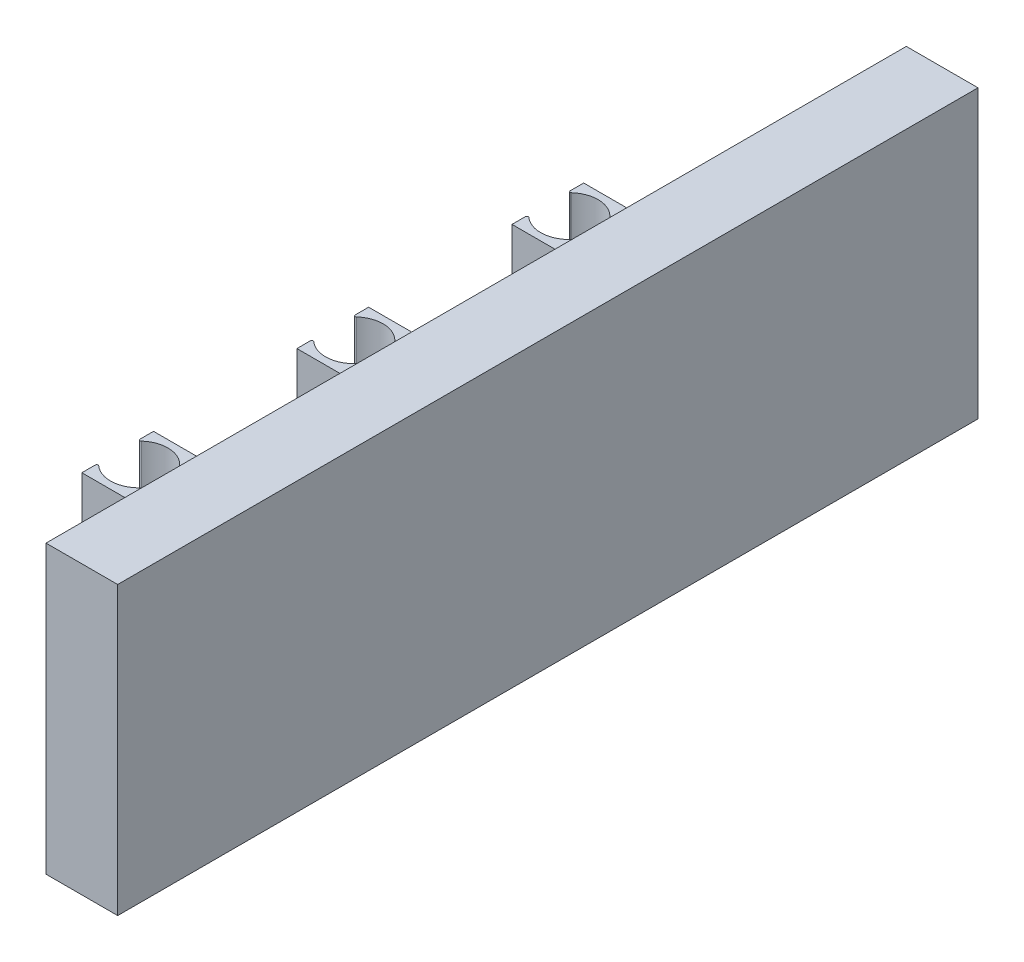
ISO-10303-21;
HEADER;
FILE_DESCRIPTION(('STEP AP214'),'2;1');
FILE_NAME('part.step','',(''),(''),'','','');
FILE_SCHEMA(('AUTOMOTIVE_DESIGN { 1 0 10303 214 1 1 1 1 }'));
ENDSEC;
DATA;
#1=APPLICATION_CONTEXT('core data for automotive mechanical design processes');
#2=APPLICATION_PROTOCOL_DEFINITION('international standard','automotive_design',2000,#1);
#3=PRODUCT_CONTEXT('',#1,'mechanical');
#4=PRODUCT('Part','Part','',(#3));
#5=PRODUCT_RELATED_PRODUCT_CATEGORY('part','',(#4));
#6=PRODUCT_DEFINITION_FORMATION('','',#4);
#7=PRODUCT_DEFINITION_CONTEXT('part definition',#1,'design');
#8=PRODUCT_DEFINITION('design','',#6,#7);
#9=PRODUCT_DEFINITION_SHAPE('','',#8);
#10=(LENGTH_UNIT() NAMED_UNIT(*) SI_UNIT(.MILLI.,.METRE.));
#11=(NAMED_UNIT(*) PLANE_ANGLE_UNIT() SI_UNIT($,.RADIAN.));
#12=(NAMED_UNIT(*) SI_UNIT($,.STERADIAN.) SOLID_ANGLE_UNIT());
#13=UNCERTAINTY_MEASURE_WITH_UNIT(LENGTH_MEASURE(1.E-05),#10,'distance_accuracy_value','');
#14=(GEOMETRIC_REPRESENTATION_CONTEXT(3) GLOBAL_UNCERTAINTY_ASSIGNED_CONTEXT((#13)) GLOBAL_UNIT_ASSIGNED_CONTEXT((#10,
#11,#12)) REPRESENTATION_CONTEXT('',''));
#15=CARTESIAN_POINT('',(0.,0.,0.));
#16=DIRECTION('',(0.,0.,1.));
#17=DIRECTION('',(1.,0.,0.));
#18=AXIS2_PLACEMENT_3D('',#15,#16,#17);
#19=CARTESIAN_POINT('',(-15.,0.,0.));
#20=DIRECTION('',(1.,0.,0.));
#21=DIRECTION('',(0.,0.,-1.));
#22=AXIS2_PLACEMENT_3D('',#19,#20,#21);
#23=PLANE('',#22);
#24=DIRECTION('',(0.,0.,1.));
#25=VECTOR('',#24,1.);
#26=CARTESIAN_POINT('',(-15.,-3.,12.5));
#27=LINE('',#26,#25);
#28=CARTESIAN_POINT('',(-15.,-3.,12.5));
#29=VERTEX_POINT('',#28);
#30=CARTESIAN_POINT('',(-15.,-3.,13.4347524157502));
#31=VERTEX_POINT('',#30);
#32=EDGE_CURVE('E406',#29,#31,#27,.T.);
#33=ORIENTED_EDGE('',*,*,#32,.T.);
#34=DIRECTION('',(0.,1.,0.));
#35=VECTOR('',#34,1.);
#36=CARTESIAN_POINT('',(-15.,0.,13.4347524157502));
#37=LINE('',#36,#35);
#38=CARTESIAN_POINT('',(-15.,3.,13.4347524157502));
#39=VERTEX_POINT('',#38);
#40=EDGE_CURVE('E390',#31,#39,#37,.T.);
#41=ORIENTED_EDGE('',*,*,#40,.T.);
#42=DIRECTION('',(0.,0.,-1.));
#43=VECTOR('',#42,1.);
#44=CARTESIAN_POINT('',(-15.,3.,12.5));
#45=LINE('',#44,#43);
#46=CARTESIAN_POINT('',(-15.,3.,12.5));
#47=VERTEX_POINT('',#46);
#48=EDGE_CURVE('E228',#39,#47,#45,.T.);
#49=ORIENTED_EDGE('',*,*,#48,.T.);
#50=DIRECTION('',(0.,-1.,0.));
#51=VECTOR('',#50,1.);
#52=CARTESIAN_POINT('',(-15.,-3.,12.5));
#53=LINE('',#52,#51);
#54=EDGE_CURVE('E227',#47,#29,#53,.T.);
#55=ORIENTED_EDGE('',*,*,#54,.T.);
#56=EDGE_LOOP('',(#33,#41,#49,#55));
#57=FACE_BOUND('',#56,.T.);
#58=ADVANCED_FACE('F33',(#57),#23,.F.);
#59=CARTESIAN_POINT('',(-15.,0.,0.));
#60=DIRECTION('',(1.,0.,0.));
#61=DIRECTION('',(0.,0.,-1.));
#62=AXIS2_PLACEMENT_3D('',#59,#60,#61);
#63=PLANE('',#62);
#64=DIRECTION('',(0.,0.,-1.));
#65=VECTOR('',#64,1.);
#66=CARTESIAN_POINT('',(-15.,3.,-2.5));
#67=LINE('',#66,#65);
#68=CARTESIAN_POINT('',(-15.,3.,2.5));
#69=VERTEX_POINT('',#68);
#70=CARTESIAN_POINT('',(-15.,3.,1.56524758424985));
#71=VERTEX_POINT('',#70);
#72=EDGE_CURVE('E257',#69,#71,#67,.T.);
#73=ORIENTED_EDGE('',*,*,#72,.T.);
#74=DIRECTION('',(0.,-1.,0.));
#75=VECTOR('',#74,1.);
#76=CARTESIAN_POINT('',(-15.,0.,1.56524758424985));
#77=LINE('',#76,#75);
#78=CARTESIAN_POINT('',(-15.,-3.,1.56524758424985));
#79=VERTEX_POINT('',#78);
#80=EDGE_CURVE('E387',#71,#79,#77,.T.);
#81=ORIENTED_EDGE('',*,*,#80,.T.);
#82=DIRECTION('',(0.,0.,1.));
#83=VECTOR('',#82,1.);
#84=CARTESIAN_POINT('',(-15.,-3.,-2.5));
#85=LINE('',#84,#83);
#86=CARTESIAN_POINT('',(-15.,-3.,2.5));
#87=VERTEX_POINT('',#86);
#88=EDGE_CURVE('E262',#79,#87,#85,.T.);
#89=ORIENTED_EDGE('',*,*,#88,.T.);
#90=DIRECTION('',(0.,1.,0.));
#91=VECTOR('',#90,1.);
#92=CARTESIAN_POINT('',(-15.,-3.,2.5));
#93=LINE('',#92,#91);
#94=EDGE_CURVE('E252',#87,#69,#93,.T.);
#95=ORIENTED_EDGE('',*,*,#94,.T.);
#96=EDGE_LOOP('',(#73,#81,#89,#95));
#97=FACE_BOUND('',#96,.T.);
#98=ADVANCED_FACE('F463',(#97),#63,.F.);
#99=CARTESIAN_POINT('',(-15.,0.,0.));
#100=DIRECTION('',(1.,0.,0.));
#101=DIRECTION('',(0.,0.,-1.));
#102=AXIS2_PLACEMENT_3D('',#99,#100,#101);
#103=PLANE('',#102);
#104=DIRECTION('',(0.,0.,1.));
#105=VECTOR('',#104,1.);
#106=CARTESIAN_POINT('',(-15.,-3.00000000000001,-17.5));
#107=LINE('',#106,#105);
#108=CARTESIAN_POINT('',(-15.,-3.00000000000001,-17.5));
#109=VERTEX_POINT('',#108);
#110=CARTESIAN_POINT('',(-15.,-3.00000000000001,-16.5652475842499));
#111=VERTEX_POINT('',#110);
#112=EDGE_CURVE('E297',#109,#111,#107,.T.);
#113=ORIENTED_EDGE('',*,*,#112,.T.);
#114=DIRECTION('',(0.,1.,0.));
#115=VECTOR('',#114,1.);
#116=CARTESIAN_POINT('',(-15.,0.,-16.5652475842499));
#117=LINE('',#116,#115);
#118=CARTESIAN_POINT('',(-15.,2.99999999999999,-16.5652475842499));
#119=VERTEX_POINT('',#118);
#120=EDGE_CURVE('E349',#111,#119,#117,.T.);
#121=ORIENTED_EDGE('',*,*,#120,.T.);
#122=DIRECTION('',(0.,0.,-1.));
#123=VECTOR('',#122,1.);
#124=CARTESIAN_POINT('',(-15.,2.99999999999999,-17.5));
#125=LINE('',#124,#123);
#126=CARTESIAN_POINT('',(-15.,2.99999999999999,-17.5));
#127=VERTEX_POINT('',#126);
#128=EDGE_CURVE('E289',#119,#127,#125,.T.);
#129=ORIENTED_EDGE('',*,*,#128,.T.);
#130=DIRECTION('',(0.,-1.,0.));
#131=VECTOR('',#130,1.);
#132=CARTESIAN_POINT('',(-15.,-3.00000000000001,-17.5));
#133=LINE('',#132,#131);
#134=EDGE_CURVE('E294',#127,#109,#133,.T.);
#135=ORIENTED_EDGE('',*,*,#134,.T.);
#136=EDGE_LOOP('',(#113,#121,#129,#135));
#137=FACE_BOUND('',#136,.T.);
#138=ADVANCED_FACE('F453',(#137),#103,.F.);
#139=CARTESIAN_POINT('',(-5.,0.,0.));
#140=DIRECTION('',(1.,0.,0.));
#141=DIRECTION('',(0.,0.,-1.));
#142=AXIS2_PLACEMENT_3D('',#139,#140,#141);
#143=PLANE('',#142);
#144=DIRECTION('',(0.,1.,0.));
#145=VECTOR('',#144,1.);
#146=CARTESIAN_POINT('',(-5.,-3.,2.5));
#147=LINE('',#146,#145);
#148=CARTESIAN_POINT('',(-5.,-3.,2.5));
#149=VERTEX_POINT('',#148);
#150=CARTESIAN_POINT('',(-5.,3.,2.5));
#151=VERTEX_POINT('',#150);
#152=EDGE_CURVE('E241',#149,#151,#147,.T.);
#153=ORIENTED_EDGE('',*,*,#152,.F.);
#154=DIRECTION('',(0.,0.,1.));
#155=VECTOR('',#154,1.);
#156=CARTESIAN_POINT('',(-5.,-3.,-2.5));
#157=LINE('',#156,#155);
#158=CARTESIAN_POINT('',(-5.,-3.,-2.5));
#159=VERTEX_POINT('',#158);
#160=EDGE_CURVE('E256',#159,#149,#157,.T.);
#161=ORIENTED_EDGE('',*,*,#160,.F.);
#162=DIRECTION('',(0.,-1.,0.));
#163=VECTOR('',#162,1.);
#164=CARTESIAN_POINT('',(-5.,-3.,-2.5));
#165=LINE('',#164,#163);
#166=CARTESIAN_POINT('',(-5.,3.,-2.5));
#167=VERTEX_POINT('',#166);
#168=EDGE_CURVE('E269',#167,#159,#165,.T.);
#169=ORIENTED_EDGE('',*,*,#168,.F.);
#170=DIRECTION('',(0.,0.,-1.));
#171=VECTOR('',#170,1.);
#172=CARTESIAN_POINT('',(-5.,3.,-2.5));
#173=LINE('',#172,#171);
#174=EDGE_CURVE('E245',#151,#167,#173,.T.);
#175=ORIENTED_EDGE('',*,*,#174,.F.);
#176=EDGE_LOOP('',(#153,#161,#169,#175));
#177=FACE_BOUND('',#176,.T.);
#178=DIRECTION('',(0.,1.,0.));
#179=VECTOR('',#178,1.);
#180=CARTESIAN_POINT('',(-5.,10.,-30.));
#181=LINE('',#180,#179);
#182=CARTESIAN_POINT('',(-5.,-10.,-30.));
#183=VERTEX_POINT('',#182);
#184=CARTESIAN_POINT('',(-5.,10.,-30.));
#185=VERTEX_POINT('',#184);
#186=EDGE_CURVE('E323',#183,#185,#181,.T.);
#187=ORIENTED_EDGE('',*,*,#186,.F.);
#188=DIRECTION('',(0.,0.,-1.));
#189=VECTOR('',#188,1.);
#190=CARTESIAN_POINT('',(-5.,-10.,30.));
#191=LINE('',#190,#189);
#192=CARTESIAN_POINT('',(-5.,-10.,30.));
#193=VERTEX_POINT('',#192);
#194=EDGE_CURVE('E333',#193,#183,#191,.T.);
#195=ORIENTED_EDGE('',*,*,#194,.F.);
#196=DIRECTION('',(0.,-1.,0.));
#197=VECTOR('',#196,1.);
#198=CARTESIAN_POINT('',(-5.,10.,30.));
#199=LINE('',#198,#197);
#200=CARTESIAN_POINT('',(-5.,10.,30.));
#201=VERTEX_POINT('',#200);
#202=EDGE_CURVE('E330',#201,#193,#199,.T.);
#203=ORIENTED_EDGE('',*,*,#202,.F.);
#204=DIRECTION('',(0.,0.,1.));
#205=VECTOR('',#204,1.);
#206=CARTESIAN_POINT('',(-5.,10.,30.));
#207=LINE('',#206,#205);
#208=EDGE_CURVE('E326',#185,#201,#207,.T.);
#209=ORIENTED_EDGE('',*,*,#208,.F.);
#210=EDGE_LOOP('',(#187,#195,#203,#209));
#211=FACE_BOUND('',#210,.T.);
#212=DIRECTION('',(0.,1.,0.));
#213=VECTOR('',#212,1.);
#214=CARTESIAN_POINT('',(-5.,-3.00000000000001,-12.5));
#215=LINE('',#214,#213);
#216=CARTESIAN_POINT('',(-5.,-3.00000000000001,-12.5));
#217=VERTEX_POINT('',#216);
#218=CARTESIAN_POINT('',(-5.,2.99999999999999,-12.5));
#219=VERTEX_POINT('',#218);
#220=EDGE_CURVE('E285',#217,#219,#215,.T.);
#221=ORIENTED_EDGE('',*,*,#220,.F.);
#222=DIRECTION('',(0.,0.,1.));
#223=VECTOR('',#222,1.);
#224=CARTESIAN_POINT('',(-5.,-3.00000000000001,-17.5));
#225=LINE('',#224,#223);
#226=CARTESIAN_POINT('',(-5.,-3.00000000000001,-17.5));
#227=VERTEX_POINT('',#226);
#228=EDGE_CURVE('E290',#227,#217,#225,.T.);
#229=ORIENTED_EDGE('',*,*,#228,.F.);
#230=DIRECTION('',(0.,-1.,0.));
#231=VECTOR('',#230,1.);
#232=CARTESIAN_POINT('',(-5.,-3.00000000000001,-17.5));
#233=LINE('',#232,#231);
#234=CARTESIAN_POINT('',(-5.,2.99999999999999,-17.5));
#235=VERTEX_POINT('',#234);
#236=EDGE_CURVE('E306',#235,#227,#233,.T.);
#237=ORIENTED_EDGE('',*,*,#236,.F.);
#238=DIRECTION('',(0.,0.,-1.));
#239=VECTOR('',#238,1.);
#240=CARTESIAN_POINT('',(-5.,2.99999999999999,-17.5));
#241=LINE('',#240,#239);
#242=EDGE_CURVE('E303',#219,#235,#241,.T.);
#243=ORIENTED_EDGE('',*,*,#242,.F.);
#244=EDGE_LOOP('',(#221,#229,#237,#243));
#245=FACE_BOUND('',#244,.T.);
#246=DIRECTION('',(0.,1.,0.));
#247=VECTOR('',#246,1.);
#248=CARTESIAN_POINT('',(-5.,-3.,17.5));
#249=LINE('',#248,#247);
#250=CARTESIAN_POINT('',(-5.,-3.,17.5));
#251=VERTEX_POINT('',#250);
#252=CARTESIAN_POINT('',(-5.,3.,17.5));
#253=VERTEX_POINT('',#252);
#254=EDGE_CURVE('E240',#251,#253,#249,.T.);
#255=ORIENTED_EDGE('',*,*,#254,.F.);
#256=DIRECTION('',(0.,0.,1.));
#257=VECTOR('',#256,1.);
#258=CARTESIAN_POINT('',(-5.,-3.,12.5));
#259=LINE('',#258,#257);
#260=CARTESIAN_POINT('',(-5.,-3.,12.5));
#261=VERTEX_POINT('',#260);
#262=EDGE_CURVE('E237',#261,#251,#259,.T.);
#263=ORIENTED_EDGE('',*,*,#262,.F.);
#264=DIRECTION('',(0.,-1.,0.));
#265=VECTOR('',#264,1.);
#266=CARTESIAN_POINT('',(-5.,-3.,12.5));
#267=LINE('',#266,#265);
#268=CARTESIAN_POINT('',(-5.,3.,12.5));
#269=VERTEX_POINT('',#268);
#270=EDGE_CURVE('E442',#269,#261,#267,.T.);
#271=ORIENTED_EDGE('',*,*,#270,.F.);
#272=DIRECTION('',(0.,0.,-1.));
#273=VECTOR('',#272,1.);
#274=CARTESIAN_POINT('',(-5.,3.,12.5));
#275=LINE('',#274,#273);
#276=EDGE_CURVE('E440',#253,#269,#275,.T.);
#277=ORIENTED_EDGE('',*,*,#276,.F.);
#278=EDGE_LOOP('',(#255,#263,#271,#277));
#279=FACE_BOUND('',#278,.T.);
#280=ADVANCED_FACE('F450',(#177,#211,#245,#279),#143,.F.);
#281=CARTESIAN_POINT('',(-5.,10.,-30.));
#282=DIRECTION('',(0.,0.,-1.));
#283=DIRECTION('',(-1.,0.,0.));
#284=AXIS2_PLACEMENT_3D('',#281,#282,#283);
#285=PLANE('',#284);
#286=DIRECTION('',(0.,1.,0.));
#287=VECTOR('',#286,1.);
#288=CARTESIAN_POINT('',(0.,10.,-30.));
#289=LINE('',#288,#287);
#290=CARTESIAN_POINT('',(0.,-10.,-30.));
#291=VERTEX_POINT('',#290);
#292=CARTESIAN_POINT('',(0.,10.,-30.));
#293=VERTEX_POINT('',#292);
#294=EDGE_CURVE('E322',#291,#293,#289,.T.);
#295=ORIENTED_EDGE('',*,*,#294,.F.);
#296=DIRECTION('',(1.,0.,0.));
#297=VECTOR('',#296,1.);
#298=CARTESIAN_POINT('',(-5.,-10.,-30.));
#299=LINE('',#298,#297);
#300=EDGE_CURVE('E347',#183,#291,#299,.T.);
#301=ORIENTED_EDGE('',*,*,#300,.F.);
#302=ORIENTED_EDGE('',*,*,#186,.T.);
#303=DIRECTION('',(1.,0.,0.));
#304=VECTOR('',#303,1.);
#305=CARTESIAN_POINT('',(-5.,10.,-30.));
#306=LINE('',#305,#304);
#307=EDGE_CURVE('E336',#185,#293,#306,.T.);
#308=ORIENTED_EDGE('',*,*,#307,.T.);
#309=EDGE_LOOP('',(#295,#301,#302,#308));
#310=FACE_BOUND('',#309,.T.);
#311=ADVANCED_FACE('F452',(#310),#285,.T.);
#312=CARTESIAN_POINT('',(-5.,-10.,30.));
#313=DIRECTION('',(0.,-1.,0.));
#314=DIRECTION('',(0.,0.,-1.));
#315=AXIS2_PLACEMENT_3D('',#312,#313,#314);
#316=PLANE('',#315);
#317=DIRECTION('',(0.,0.,-1.));
#318=VECTOR('',#317,1.);
#319=CARTESIAN_POINT('',(0.,-10.,30.));
#320=LINE('',#319,#318);
#321=CARTESIAN_POINT('',(0.,-10.,30.));
#322=VERTEX_POINT('',#321);
#323=EDGE_CURVE('E327',#322,#291,#320,.T.);
#324=ORIENTED_EDGE('',*,*,#323,.F.);
#325=DIRECTION('',(1.,0.,0.));
#326=VECTOR('',#325,1.);
#327=CARTESIAN_POINT('',(-5.,-10.,30.));
#328=LINE('',#327,#326);
#329=EDGE_CURVE('E350',#193,#322,#328,.T.);
#330=ORIENTED_EDGE('',*,*,#329,.F.);
#331=ORIENTED_EDGE('',*,*,#194,.T.);
#332=ORIENTED_EDGE('',*,*,#300,.T.);
#333=EDGE_LOOP('',(#324,#330,#331,#332));
#334=FACE_BOUND('',#333,.T.);
#335=ADVANCED_FACE('F460',(#334),#316,.T.);
#336=CARTESIAN_POINT('',(-5.,10.,30.));
#337=DIRECTION('',(0.,0.,1.));
#338=DIRECTION('',(0.,-1.,0.));
#339=AXIS2_PLACEMENT_3D('',#336,#337,#338);
#340=PLANE('',#339);
#341=DIRECTION('',(0.,-1.,0.));
#342=VECTOR('',#341,1.);
#343=CARTESIAN_POINT('',(0.,10.,30.));
#344=LINE('',#343,#342);
#345=CARTESIAN_POINT('',(0.,10.,30.));
#346=VERTEX_POINT('',#345);
#347=EDGE_CURVE('E342',#346,#322,#344,.T.);
#348=ORIENTED_EDGE('',*,*,#347,.F.);
#349=DIRECTION('',(1.,0.,0.));
#350=VECTOR('',#349,1.);
#351=CARTESIAN_POINT('',(-5.,10.,30.));
#352=LINE('',#351,#350);
#353=EDGE_CURVE('E352',#201,#346,#352,.T.);
#354=ORIENTED_EDGE('',*,*,#353,.F.);
#355=ORIENTED_EDGE('',*,*,#202,.T.);
#356=ORIENTED_EDGE('',*,*,#329,.T.);
#357=EDGE_LOOP('',(#348,#354,#355,#356));
#358=FACE_BOUND('',#357,.T.);
#359=ADVANCED_FACE('F749',(#358),#340,.T.);
#360=CARTESIAN_POINT('',(-5.,10.,30.));
#361=DIRECTION('',(0.,1.,0.));
#362=DIRECTION('',(0.,0.,1.));
#363=AXIS2_PLACEMENT_3D('',#360,#361,#362);
#364=PLANE('',#363);
#365=DIRECTION('',(0.,0.,1.));
#366=VECTOR('',#365,1.);
#367=CARTESIAN_POINT('',(0.,10.,30.));
#368=LINE('',#367,#366);
#369=EDGE_CURVE('E339',#293,#346,#368,.T.);
#370=ORIENTED_EDGE('',*,*,#369,.F.);
#371=ORIENTED_EDGE('',*,*,#307,.F.);
#372=ORIENTED_EDGE('',*,*,#208,.T.);
#373=ORIENTED_EDGE('',*,*,#353,.T.);
#374=EDGE_LOOP('',(#370,#371,#372,#373));
#375=FACE_BOUND('',#374,.T.);
#376=ADVANCED_FACE('F535',(#375),#364,.T.);
#377=CARTESIAN_POINT('',(0.,0.,0.));
#378=DIRECTION('',(1.,0.,0.));
#379=DIRECTION('',(0.,0.,-1.));
#380=AXIS2_PLACEMENT_3D('',#377,#378,#379);
#381=PLANE('',#380);
#382=ORIENTED_EDGE('',*,*,#294,.T.);
#383=ORIENTED_EDGE('',*,*,#369,.T.);
#384=ORIENTED_EDGE('',*,*,#347,.T.);
#385=ORIENTED_EDGE('',*,*,#323,.T.);
#386=EDGE_LOOP('',(#382,#383,#384,#385));
#387=FACE_BOUND('',#386,.T.);
#388=ADVANCED_FACE('F530',(#387),#381,.T.);
#389=CARTESIAN_POINT('',(-15.,-3.00000000000001,-12.5));
#390=DIRECTION('',(0.,0.,-1.));
#391=DIRECTION('',(-1.,0.,0.));
#392=AXIS2_PLACEMENT_3D('',#389,#390,#391);
#393=PLANE('',#392);
#394=ORIENTED_EDGE('',*,*,#220,.T.);
#395=DIRECTION('',(1.,0.,0.));
#396=VECTOR('',#395,1.);
#397=CARTESIAN_POINT('',(-15.,2.99999999999999,-12.5));
#398=LINE('',#397,#396);
#399=CARTESIAN_POINT('',(-15.,2.99999999999999,-12.5));
#400=VERTEX_POINT('',#399);
#401=EDGE_CURVE('E319',#400,#219,#398,.T.);
#402=ORIENTED_EDGE('',*,*,#401,.F.);
#403=DIRECTION('',(0.,1.,0.));
#404=VECTOR('',#403,1.);
#405=CARTESIAN_POINT('',(-15.,-3.00000000000001,-12.5));
#406=LINE('',#405,#404);
#407=CARTESIAN_POINT('',(-15.,-3.00000000000001,-12.5));
#408=VERTEX_POINT('',#407);
#409=EDGE_CURVE('E286',#408,#400,#406,.T.);
#410=ORIENTED_EDGE('',*,*,#409,.F.);
#411=DIRECTION('',(1.,0.,0.));
#412=VECTOR('',#411,1.);
#413=CARTESIAN_POINT('',(-15.,-3.00000000000001,-12.5));
#414=LINE('',#413,#412);
#415=EDGE_CURVE('E300',#408,#217,#414,.T.);
#416=ORIENTED_EDGE('',*,*,#415,.T.);
#417=EDGE_LOOP('',(#394,#402,#410,#416));
#418=FACE_BOUND('',#417,.T.);
#419=ADVANCED_FACE('F527',(#418),#393,.F.);
#420=CARTESIAN_POINT('',(-15.,2.99999999999999,-17.5));
#421=DIRECTION('',(0.,-1.,0.));
#422=DIRECTION('',(0.,0.,-1.));
#423=AXIS2_PLACEMENT_3D('',#420,#421,#422);
#424=PLANE('',#423);
#425=ORIENTED_EDGE('',*,*,#128,.F.);
#426=CARTESIAN_POINT('',(-14.9,2.99999999999999,-16.5652475842499));
#427=DIRECTION('',(0.,-1.,0.));
#428=DIRECTION('',(0.,0.,-1.));
#429=AXIS2_PLACEMENT_3D('',#426,#427,#428);
#430=CIRCLE('',#429,0.1);
#431=CARTESIAN_POINT('',(-14.8333333333333,2.99999999999999,-16.4907119849999));
#432=VERTEX_POINT('',#431);
#433=EDGE_CURVE('E359',#119,#432,#430,.F.);
#434=ORIENTED_EDGE('',*,*,#433,.T.);
#435=CARTESIAN_POINT('',(-13.5,2.99999999999999,-15.));
#436=DIRECTION('',(0.,-1.,0.));
#437=DIRECTION('',(0.,0.,-1.));
#438=AXIS2_PLACEMENT_3D('',#435,#436,#437);
#439=CIRCLE('',#438,2.);
#440=CARTESIAN_POINT('',(-14.8333333333333,2.99999999999999,-13.5092880150001));
#441=VERTEX_POINT('',#440);
#442=EDGE_CURVE('E435',#432,#441,#439,.T.);
#443=ORIENTED_EDGE('',*,*,#442,.T.);
#444=CARTESIAN_POINT('',(-14.9,2.99999999999999,-13.4347524157501));
#445=DIRECTION('',(0.,-1.,0.));
#446=DIRECTION('',(0.,0.,-1.));
#447=AXIS2_PLACEMENT_3D('',#444,#445,#446);
#448=CIRCLE('',#447,0.1);
#449=CARTESIAN_POINT('',(-15.,2.99999999999999,-13.4347524157501));
#450=VERTEX_POINT('',#449);
#451=EDGE_CURVE('E357',#441,#450,#448,.F.);
#452=ORIENTED_EDGE('',*,*,#451,.T.);
#453=EDGE_CURVE('E291',#400,#450,#125,.T.);
#454=ORIENTED_EDGE('',*,*,#453,.F.);
#455=ORIENTED_EDGE('',*,*,#401,.T.);
#456=ORIENTED_EDGE('',*,*,#242,.T.);
#457=DIRECTION('',(1.,0.,0.));
#458=VECTOR('',#457,1.);
#459=CARTESIAN_POINT('',(-15.,2.99999999999999,-17.5));
#460=LINE('',#459,#458);
#461=EDGE_CURVE('E316',#127,#235,#460,.T.);
#462=ORIENTED_EDGE('',*,*,#461,.F.);
#463=EDGE_LOOP('',(#425,#434,#443,#452,#454,#455,#456,#462));
#464=FACE_BOUND('',#463,.T.);
#465=ADVANCED_FACE('F524',(#464),#424,.F.);
#466=CARTESIAN_POINT('',(-15.,-3.00000000000001,-17.5));
#467=DIRECTION('',(0.,0.,1.));
#468=DIRECTION('',(0.,-1.,0.));
#469=AXIS2_PLACEMENT_3D('',#466,#467,#468);
#470=PLANE('',#469);
#471=ORIENTED_EDGE('',*,*,#236,.T.);
#472=DIRECTION('',(1.,0.,0.));
#473=VECTOR('',#472,1.);
#474=CARTESIAN_POINT('',(-15.,-3.00000000000001,-17.5));
#475=LINE('',#474,#473);
#476=EDGE_CURVE('E313',#109,#227,#475,.T.);
#477=ORIENTED_EDGE('',*,*,#476,.F.);
#478=ORIENTED_EDGE('',*,*,#134,.F.);
#479=ORIENTED_EDGE('',*,*,#461,.T.);
#480=EDGE_LOOP('',(#471,#477,#478,#479));
#481=FACE_BOUND('',#480,.T.);
#482=ADVANCED_FACE('F520',(#481),#470,.F.);
#483=CARTESIAN_POINT('',(-15.,-3.00000000000001,-17.5));
#484=DIRECTION('',(0.,1.,0.));
#485=DIRECTION('',(0.,0.,1.));
#486=AXIS2_PLACEMENT_3D('',#483,#484,#485);
#487=PLANE('',#486);
#488=CARTESIAN_POINT('',(-13.5,-3.,-15.));
#489=DIRECTION('',(0.,1.,0.));
#490=DIRECTION('',(0.,0.,1.));
#491=AXIS2_PLACEMENT_3D('',#488,#489,#490);
#492=CIRCLE('',#491,2.);
#493=CARTESIAN_POINT('',(-14.8333333333333,-3.,-16.4907119849999));
#494=VERTEX_POINT('',#493);
#495=CARTESIAN_POINT('',(-14.8333333333333,-3.,-13.5092880150001));
#496=VERTEX_POINT('',#495);
#497=EDGE_CURVE('E432',#494,#496,#492,.F.);
#498=ORIENTED_EDGE('',*,*,#497,.F.);
#499=CARTESIAN_POINT('',(-14.9,-3.,-16.5652475842499));
#500=DIRECTION('',(0.,1.,0.));
#501=DIRECTION('',(0.,0.,1.));
#502=AXIS2_PLACEMENT_3D('',#499,#500,#501);
#503=CIRCLE('',#502,0.1);
#504=EDGE_CURVE('E368',#494,#111,#503,.F.);
#505=ORIENTED_EDGE('',*,*,#504,.T.);
#506=ORIENTED_EDGE('',*,*,#112,.F.);
#507=ORIENTED_EDGE('',*,*,#476,.T.);
#508=ORIENTED_EDGE('',*,*,#228,.T.);
#509=ORIENTED_EDGE('',*,*,#415,.F.);
#510=CARTESIAN_POINT('',(-15.,-3.00000000000001,-13.4347524157501));
#511=VERTEX_POINT('',#510);
#512=EDGE_CURVE('E296',#511,#408,#107,.T.);
#513=ORIENTED_EDGE('',*,*,#512,.F.);
#514=CARTESIAN_POINT('',(-14.9,-3.,-13.4347524157501));
#515=DIRECTION('',(0.,1.,0.));
#516=DIRECTION('',(0.,0.,1.));
#517=AXIS2_PLACEMENT_3D('',#514,#515,#516);
#518=CIRCLE('',#517,0.1);
#519=EDGE_CURVE('E366',#511,#496,#518,.F.);
#520=ORIENTED_EDGE('',*,*,#519,.T.);
#521=EDGE_LOOP('',(#498,#505,#506,#507,#508,#509,#513,#520));
#522=FACE_BOUND('',#521,.T.);
#523=ADVANCED_FACE('F516',(#522),#487,.F.);
#524=ORIENTED_EDGE('',*,*,#453,.T.);
#525=DIRECTION('',(0.,1.,0.));
#526=VECTOR('',#525,1.);
#527=CARTESIAN_POINT('',(-15.,0.,-13.4347524157501));
#528=LINE('',#527,#526);
#529=EDGE_CURVE('E370',#450,#511,#528,.F.);
#530=ORIENTED_EDGE('',*,*,#529,.T.);
#531=ORIENTED_EDGE('',*,*,#512,.T.);
#532=ORIENTED_EDGE('',*,*,#409,.T.);
#533=EDGE_LOOP('',(#524,#530,#531,#532));
#534=FACE_BOUND('',#533,.T.);
#535=ADVANCED_FACE('F466',(#534),#103,.F.);
#536=CARTESIAN_POINT('',(-15.,-3.,2.5));
#537=DIRECTION('',(0.,0.,-1.));
#538=DIRECTION('',(-1.,0.,0.));
#539=AXIS2_PLACEMENT_3D('',#536,#537,#538);
#540=PLANE('',#539);
#541=ORIENTED_EDGE('',*,*,#152,.T.);
#542=DIRECTION('',(1.,0.,0.));
#543=VECTOR('',#542,1.);
#544=CARTESIAN_POINT('',(-15.,3.,2.5));
#545=LINE('',#544,#543);
#546=EDGE_CURVE('E282',#69,#151,#545,.T.);
#547=ORIENTED_EDGE('',*,*,#546,.F.);
#548=ORIENTED_EDGE('',*,*,#94,.F.);
#549=DIRECTION('',(1.,0.,0.));
#550=VECTOR('',#549,1.);
#551=CARTESIAN_POINT('',(-15.,-3.,2.5));
#552=LINE('',#551,#550);
#553=EDGE_CURVE('E265',#87,#149,#552,.T.);
#554=ORIENTED_EDGE('',*,*,#553,.T.);
#555=EDGE_LOOP('',(#541,#547,#548,#554));
#556=FACE_BOUND('',#555,.T.);
#557=ADVANCED_FACE('F510',(#556),#540,.F.);
#558=CARTESIAN_POINT('',(-15.,3.,-2.5));
#559=DIRECTION('',(0.,-1.,0.));
#560=DIRECTION('',(0.,0.,-1.));
#561=AXIS2_PLACEMENT_3D('',#558,#559,#560);
#562=PLANE('',#561);
#563=CARTESIAN_POINT('',(-15.,3.,-1.56524758424985));
#564=VERTEX_POINT('',#563);
#565=CARTESIAN_POINT('',(-15.,3.,-2.5));
#566=VERTEX_POINT('',#565);
#567=EDGE_CURVE('E255',#564,#566,#67,.T.);
#568=ORIENTED_EDGE('',*,*,#567,.F.);
#569=CARTESIAN_POINT('',(-14.9,3.,-1.56524758424985));
#570=DIRECTION('',(0.,-1.,0.));
#571=DIRECTION('',(0.,0.,-1.));
#572=AXIS2_PLACEMENT_3D('',#569,#570,#571);
#573=CIRCLE('',#572,0.1);
#574=CARTESIAN_POINT('',(-14.8333333333333,3.,-1.49071198499986));
#575=VERTEX_POINT('',#574);
#576=EDGE_CURVE('E385',#564,#575,#573,.F.);
#577=ORIENTED_EDGE('',*,*,#576,.T.);
#578=CARTESIAN_POINT('',(-13.5,3.,0.));
#579=DIRECTION('',(0.,-1.,0.));
#580=DIRECTION('',(0.,0.,-1.));
#581=AXIS2_PLACEMENT_3D('',#578,#579,#580);
#582=CIRCLE('',#581,2.);
#583=CARTESIAN_POINT('',(-14.8333333333333,3.,1.49071198499986));
#584=VERTEX_POINT('',#583);
#585=EDGE_CURVE('E423',#584,#575,#582,.F.);
#586=ORIENTED_EDGE('',*,*,#585,.F.);
#587=CARTESIAN_POINT('',(-14.9,3.,1.56524758424985));
#588=DIRECTION('',(0.,-1.,0.));
#589=DIRECTION('',(0.,0.,-1.));
#590=AXIS2_PLACEMENT_3D('',#587,#588,#589);
#591=CIRCLE('',#590,0.1);
#592=EDGE_CURVE('E383',#584,#71,#591,.F.);
#593=ORIENTED_EDGE('',*,*,#592,.T.);
#594=ORIENTED_EDGE('',*,*,#72,.F.);
#595=ORIENTED_EDGE('',*,*,#546,.T.);
#596=ORIENTED_EDGE('',*,*,#174,.T.);
#597=DIRECTION('',(1.,0.,0.));
#598=VECTOR('',#597,1.);
#599=CARTESIAN_POINT('',(-15.,3.,-2.5));
#600=LINE('',#599,#598);
#601=EDGE_CURVE('E279',#566,#167,#600,.T.);
#602=ORIENTED_EDGE('',*,*,#601,.F.);
#603=EDGE_LOOP('',(#568,#577,#586,#593,#594,#595,#596,#602));
#604=FACE_BOUND('',#603,.T.);
#605=ADVANCED_FACE('F506',(#604),#562,.F.);
#606=CARTESIAN_POINT('',(-15.,-3.,-2.5));
#607=DIRECTION('',(0.,0.,1.));
#608=DIRECTION('',(1.,0.,0.));
#609=AXIS2_PLACEMENT_3D('',#606,#607,#608);
#610=PLANE('',#609);
#611=ORIENTED_EDGE('',*,*,#168,.T.);
#612=DIRECTION('',(1.,0.,0.));
#613=VECTOR('',#612,1.);
#614=CARTESIAN_POINT('',(-15.,-3.,-2.5));
#615=LINE('',#614,#613);
#616=CARTESIAN_POINT('',(-15.,-3.,-2.5));
#617=VERTEX_POINT('',#616);
#618=EDGE_CURVE('E276',#617,#159,#615,.T.);
#619=ORIENTED_EDGE('',*,*,#618,.F.);
#620=DIRECTION('',(0.,-1.,0.));
#621=VECTOR('',#620,1.);
#622=CARTESIAN_POINT('',(-15.,-3.,-2.5));
#623=LINE('',#622,#621);
#624=EDGE_CURVE('E260',#566,#617,#623,.T.);
#625=ORIENTED_EDGE('',*,*,#624,.F.);
#626=ORIENTED_EDGE('',*,*,#601,.T.);
#627=EDGE_LOOP('',(#611,#619,#625,#626));
#628=FACE_BOUND('',#627,.T.);
#629=ADVANCED_FACE('F502',(#628),#610,.F.);
#630=CARTESIAN_POINT('',(-15.,-3.,-2.5));
#631=DIRECTION('',(0.,1.,0.));
#632=DIRECTION('',(0.,0.,1.));
#633=AXIS2_PLACEMENT_3D('',#630,#631,#632);
#634=PLANE('',#633);
#635=CARTESIAN_POINT('',(-13.5,-3.,0.));
#636=DIRECTION('',(0.,1.,0.));
#637=DIRECTION('',(0.,0.,1.));
#638=AXIS2_PLACEMENT_3D('',#635,#636,#637);
#639=CIRCLE('',#638,2.);
#640=CARTESIAN_POINT('',(-14.8333333333333,-3.,1.49071198499986));
#641=VERTEX_POINT('',#640);
#642=CARTESIAN_POINT('',(-14.8333333333333,-3.,-1.49071198499986));
#643=VERTEX_POINT('',#642);
#644=EDGE_CURVE('E426',#641,#643,#639,.T.);
#645=ORIENTED_EDGE('',*,*,#644,.T.);
#646=CARTESIAN_POINT('',(-14.9,-3.,-1.56524758424985));
#647=DIRECTION('',(0.,1.,0.));
#648=DIRECTION('',(0.,0.,1.));
#649=AXIS2_PLACEMENT_3D('',#646,#647,#648);
#650=CIRCLE('',#649,0.1);
#651=CARTESIAN_POINT('',(-15.,-3.,-1.56524758424985));
#652=VERTEX_POINT('',#651);
#653=EDGE_CURVE('E379',#643,#652,#650,.F.);
#654=ORIENTED_EDGE('',*,*,#653,.T.);
#655=EDGE_CURVE('E263',#617,#652,#85,.T.);
#656=ORIENTED_EDGE('',*,*,#655,.F.);
#657=ORIENTED_EDGE('',*,*,#618,.T.);
#658=ORIENTED_EDGE('',*,*,#160,.T.);
#659=ORIENTED_EDGE('',*,*,#553,.F.);
#660=ORIENTED_EDGE('',*,*,#88,.F.);
#661=CARTESIAN_POINT('',(-14.9,-3.,1.56524758424985));
#662=DIRECTION('',(0.,1.,0.));
#663=DIRECTION('',(0.,0.,1.));
#664=AXIS2_PLACEMENT_3D('',#661,#662,#663);
#665=CIRCLE('',#664,0.1);
#666=EDGE_CURVE('E377',#79,#641,#665,.F.);
#667=ORIENTED_EDGE('',*,*,#666,.T.);
#668=EDGE_LOOP('',(#645,#654,#656,#657,#658,#659,#660,#667));
#669=FACE_BOUND('',#668,.T.);
#670=ADVANCED_FACE('F498',(#669),#634,.F.);
#671=ORIENTED_EDGE('',*,*,#655,.T.);
#672=DIRECTION('',(0.,-1.,0.));
#673=VECTOR('',#672,1.);
#674=CARTESIAN_POINT('',(-15.,0.,-1.56524758424985));
#675=LINE('',#674,#673);
#676=EDGE_CURVE('E381',#652,#564,#675,.F.);
#677=ORIENTED_EDGE('',*,*,#676,.T.);
#678=ORIENTED_EDGE('',*,*,#567,.T.);
#679=ORIENTED_EDGE('',*,*,#624,.T.);
#680=EDGE_LOOP('',(#671,#677,#678,#679));
#681=FACE_BOUND('',#680,.T.);
#682=ADVANCED_FACE('F477',(#681),#63,.F.);
#683=CARTESIAN_POINT('',(-15.,-3.,17.5));
#684=DIRECTION('',(0.,0.,-1.));
#685=DIRECTION('',(-1.,0.,0.));
#686=AXIS2_PLACEMENT_3D('',#683,#684,#685);
#687=PLANE('',#686);
#688=ORIENTED_EDGE('',*,*,#254,.T.);
#689=DIRECTION('',(1.,0.,0.));
#690=VECTOR('',#689,1.);
#691=CARTESIAN_POINT('',(-15.,3.,17.5));
#692=LINE('',#691,#690);
#693=CARTESIAN_POINT('',(-15.,3.,17.5));
#694=VERTEX_POINT('',#693);
#695=EDGE_CURVE('E223',#694,#253,#692,.T.);
#696=ORIENTED_EDGE('',*,*,#695,.F.);
#697=DIRECTION('',(0.,1.,0.));
#698=VECTOR('',#697,1.);
#699=CARTESIAN_POINT('',(-15.,-3.,17.5));
#700=LINE('',#699,#698);
#701=CARTESIAN_POINT('',(-15.,-3.,17.5));
#702=VERTEX_POINT('',#701);
#703=EDGE_CURVE('E231',#702,#694,#700,.T.);
#704=ORIENTED_EDGE('',*,*,#703,.F.);
#705=DIRECTION('',(1.,0.,0.));
#706=VECTOR('',#705,1.);
#707=CARTESIAN_POINT('',(-15.,-3.,17.5));
#708=LINE('',#707,#706);
#709=EDGE_CURVE('E414',#702,#251,#708,.T.);
#710=ORIENTED_EDGE('',*,*,#709,.T.);
#711=EDGE_LOOP('',(#688,#696,#704,#710));
#712=FACE_BOUND('',#711,.T.);
#713=ADVANCED_FACE('F239',(#712),#687,.F.);
#714=CARTESIAN_POINT('',(-15.,3.,12.5));
#715=DIRECTION('',(0.,-1.,0.));
#716=DIRECTION('',(0.,0.,-1.));
#717=AXIS2_PLACEMENT_3D('',#714,#715,#716);
#718=PLANE('',#717);
#719=ORIENTED_EDGE('',*,*,#48,.F.);
#720=CARTESIAN_POINT('',(-14.9,3.,13.4347524157502));
#721=DIRECTION('',(0.,-1.,0.));
#722=DIRECTION('',(0.,0.,-1.));
#723=AXIS2_PLACEMENT_3D('',#720,#721,#722);
#724=CIRCLE('',#723,0.1);
#725=CARTESIAN_POINT('',(-14.8333333333333,3.,13.5092880150001));
#726=VERTEX_POINT('',#725);
#727=EDGE_CURVE('E394',#39,#726,#724,.F.);
#728=ORIENTED_EDGE('',*,*,#727,.T.);
#729=CARTESIAN_POINT('',(-13.5,3.,15.));
#730=DIRECTION('',(0.,-1.,0.));
#731=DIRECTION('',(0.,0.,-1.));
#732=AXIS2_PLACEMENT_3D('',#729,#730,#731);
#733=CIRCLE('',#732,2.);
#734=CARTESIAN_POINT('',(-14.8333333333333,3.,16.4907119849999));
#735=VERTEX_POINT('',#734);
#736=EDGE_CURVE('E418',#726,#735,#733,.T.);
#737=ORIENTED_EDGE('',*,*,#736,.T.);
#738=CARTESIAN_POINT('',(-14.9,3.,16.5652475842499));
#739=DIRECTION('',(0.,-1.,0.));
#740=DIRECTION('',(0.,0.,-1.));
#741=AXIS2_PLACEMENT_3D('',#738,#739,#740);
#742=CIRCLE('',#741,0.1);
#743=CARTESIAN_POINT('',(-15.,3.,16.5652475842499));
#744=VERTEX_POINT('',#743);
#745=EDGE_CURVE('E226',#735,#744,#742,.F.);
#746=ORIENTED_EDGE('',*,*,#745,.T.);
#747=EDGE_CURVE('E217',#694,#744,#45,.T.);
#748=ORIENTED_EDGE('',*,*,#747,.F.);
#749=ORIENTED_EDGE('',*,*,#695,.T.);
#750=ORIENTED_EDGE('',*,*,#276,.T.);
#751=DIRECTION('',(1.,0.,0.));
#752=VECTOR('',#751,1.);
#753=CARTESIAN_POINT('',(-15.,3.,12.5));
#754=LINE('',#753,#752);
#755=EDGE_CURVE('E242',#47,#269,#754,.T.);
#756=ORIENTED_EDGE('',*,*,#755,.F.);
#757=EDGE_LOOP('',(#719,#728,#737,#746,#748,#749,#750,#756));
#758=FACE_BOUND('',#757,.T.);
#759=ADVANCED_FACE('F220',(#758),#718,.F.);
#760=CARTESIAN_POINT('',(-15.,-3.,12.5));
#761=DIRECTION('',(0.,0.,1.));
#762=DIRECTION('',(1.,0.,0.));
#763=AXIS2_PLACEMENT_3D('',#760,#761,#762);
#764=PLANE('',#763);
#765=ORIENTED_EDGE('',*,*,#270,.T.);
#766=DIRECTION('',(1.,0.,0.));
#767=VECTOR('',#766,1.);
#768=CARTESIAN_POINT('',(-15.,-3.,12.5));
#769=LINE('',#768,#767);
#770=EDGE_CURVE('E248',#29,#261,#769,.T.);
#771=ORIENTED_EDGE('',*,*,#770,.F.);
#772=ORIENTED_EDGE('',*,*,#54,.F.);
#773=ORIENTED_EDGE('',*,*,#755,.T.);
#774=EDGE_LOOP('',(#765,#771,#772,#773));
#775=FACE_BOUND('',#774,.T.);
#776=ADVANCED_FACE('F448',(#775),#764,.F.);
#777=CARTESIAN_POINT('',(-15.,-3.,12.5));
#778=DIRECTION('',(0.,1.,0.));
#779=DIRECTION('',(0.,0.,1.));
#780=AXIS2_PLACEMENT_3D('',#777,#778,#779);
#781=PLANE('',#780);
#782=CARTESIAN_POINT('',(-13.5,-3.,15.));
#783=DIRECTION('',(0.,1.,0.));
#784=DIRECTION('',(0.,0.,1.));
#785=AXIS2_PLACEMENT_3D('',#782,#783,#784);
#786=CIRCLE('',#785,2.);
#787=CARTESIAN_POINT('',(-14.8333333333333,-3.,13.5092880150001));
#788=VERTEX_POINT('',#787);
#789=CARTESIAN_POINT('',(-14.8333333333333,-3.,16.4907119849999));
#790=VERTEX_POINT('',#789);
#791=EDGE_CURVE('E407',#788,#790,#786,.F.);
#792=ORIENTED_EDGE('',*,*,#791,.F.);
#793=CARTESIAN_POINT('',(-14.9,-3.,13.4347524157502));
#794=DIRECTION('',(0.,1.,0.));
#795=DIRECTION('',(0.,0.,1.));
#796=AXIS2_PLACEMENT_3D('',#793,#794,#795);
#797=CIRCLE('',#796,0.1);
#798=EDGE_CURVE('E41',#788,#31,#797,.F.);
#799=ORIENTED_EDGE('',*,*,#798,.T.);
#800=ORIENTED_EDGE('',*,*,#32,.F.);
#801=ORIENTED_EDGE('',*,*,#770,.T.);
#802=ORIENTED_EDGE('',*,*,#262,.T.);
#803=ORIENTED_EDGE('',*,*,#709,.F.);
#804=CARTESIAN_POINT('',(-15.,-3.,16.5652475842499));
#805=VERTEX_POINT('',#804);
#806=EDGE_CURVE('E233',#805,#702,#27,.T.);
#807=ORIENTED_EDGE('',*,*,#806,.F.);
#808=CARTESIAN_POINT('',(-14.9,-3.,16.5652475842499));
#809=DIRECTION('',(0.,1.,0.));
#810=DIRECTION('',(0.,0.,1.));
#811=AXIS2_PLACEMENT_3D('',#808,#809,#810);
#812=CIRCLE('',#811,0.1);
#813=EDGE_CURVE('E53',#805,#790,#812,.F.);
#814=ORIENTED_EDGE('',*,*,#813,.T.);
#815=EDGE_LOOP('',(#792,#799,#800,#801,#802,#803,#807,#814));
#816=FACE_BOUND('',#815,.T.);
#817=ADVANCED_FACE('F404',(#816),#781,.F.);
#818=ORIENTED_EDGE('',*,*,#747,.T.);
#819=DIRECTION('',(0.,1.,0.));
#820=VECTOR('',#819,1.);
#821=CARTESIAN_POINT('',(-15.,0.,16.5652475842499));
#822=LINE('',#821,#820);
#823=EDGE_CURVE('E11',#744,#805,#822,.F.);
#824=ORIENTED_EDGE('',*,*,#823,.T.);
#825=ORIENTED_EDGE('',*,*,#806,.T.);
#826=ORIENTED_EDGE('',*,*,#703,.T.);
#827=EDGE_LOOP('',(#818,#824,#825,#826));
#828=FACE_BOUND('',#827,.T.);
#829=ADVANCED_FACE('F232',(#828),#23,.F.);
#830=CARTESIAN_POINT('',(-13.5,-93.,-15.));
#831=DIRECTION('',(0.,1.,0.));
#832=DIRECTION('',(0.,0.,1.));
#833=AXIS2_PLACEMENT_3D('',#830,#831,#832);
#834=CYLINDRICAL_SURFACE('',#833,2.);
#835=ORIENTED_EDGE('',*,*,#442,.F.);
#836=DIRECTION('',(0.,1.,0.));
#837=VECTOR('',#836,1.);
#838=CARTESIAN_POINT('',(-14.8333333333333,-93.,-16.4907119849999));
#839=LINE('',#838,#837);
#840=EDGE_CURVE('E364',#432,#494,#839,.F.);
#841=ORIENTED_EDGE('',*,*,#840,.T.);
#842=ORIENTED_EDGE('',*,*,#497,.T.);
#843=DIRECTION('',(0.,1.,0.));
#844=VECTOR('',#843,1.);
#845=CARTESIAN_POINT('',(-14.8333333333333,-93.,-13.5092880150001));
#846=LINE('',#845,#844);
#847=EDGE_CURVE('E361',#496,#441,#846,.T.);
#848=ORIENTED_EDGE('',*,*,#847,.T.);
#849=EDGE_LOOP('',(#835,#841,#842,#848));
#850=FACE_BOUND('',#849,.T.);
#851=ADVANCED_FACE('F481',(#850),#834,.F.);
#852=CARTESIAN_POINT('',(-13.5,91.75,0.));
#853=DIRECTION('',(0.,-1.,0.));
#854=DIRECTION('',(0.,0.,-1.));
#855=AXIS2_PLACEMENT_3D('',#852,#853,#854);
#856=CYLINDRICAL_SURFACE('',#855,2.);
#857=ORIENTED_EDGE('',*,*,#585,.T.);
#858=DIRECTION('',(0.,-1.,0.));
#859=VECTOR('',#858,1.);
#860=CARTESIAN_POINT('',(-14.8333333333333,91.75,-1.49071198499986));
#861=LINE('',#860,#859);
#862=EDGE_CURVE('E374',#575,#643,#861,.T.);
#863=ORIENTED_EDGE('',*,*,#862,.T.);
#864=ORIENTED_EDGE('',*,*,#644,.F.);
#865=DIRECTION('',(0.,-1.,0.));
#866=VECTOR('',#865,1.);
#867=CARTESIAN_POINT('',(-14.8333333333333,91.75,1.49071198499986));
#868=LINE('',#867,#866);
#869=EDGE_CURVE('E372',#641,#584,#868,.F.);
#870=ORIENTED_EDGE('',*,*,#869,.T.);
#871=EDGE_LOOP('',(#857,#863,#864,#870));
#872=FACE_BOUND('',#871,.T.);
#873=ADVANCED_FACE('F486',(#872),#856,.F.);
#874=CARTESIAN_POINT('',(-13.5,-91.75,15.));
#875=DIRECTION('',(0.,1.,0.));
#876=DIRECTION('',(0.,0.,1.));
#877=AXIS2_PLACEMENT_3D('',#874,#875,#876);
#878=CYLINDRICAL_SURFACE('',#877,2.);
#879=ORIENTED_EDGE('',*,*,#736,.F.);
#880=DIRECTION('',(0.,1.,0.));
#881=VECTOR('',#880,1.);
#882=CARTESIAN_POINT('',(-14.8333333333333,-91.75,13.5092880150001));
#883=LINE('',#882,#881);
#884=EDGE_CURVE('E399',#726,#788,#883,.F.);
#885=ORIENTED_EDGE('',*,*,#884,.T.);
#886=ORIENTED_EDGE('',*,*,#791,.T.);
#887=DIRECTION('',(0.,1.,0.));
#888=VECTOR('',#887,1.);
#889=CARTESIAN_POINT('',(-14.8333333333333,-91.75,16.4907119849999));
#890=LINE('',#889,#888);
#891=EDGE_CURVE('E396',#790,#735,#890,.T.);
#892=ORIENTED_EDGE('',*,*,#891,.T.);
#893=EDGE_LOOP('',(#879,#885,#886,#892));
#894=FACE_BOUND('',#893,.T.);
#895=ADVANCED_FACE('F421',(#894),#878,.F.);
#896=CARTESIAN_POINT('',(-14.9,-93.,-16.5652475842499));
#897=DIRECTION('',(0.,1.,0.));
#898=DIRECTION('',(0.,0.,1.));
#899=AXIS2_PLACEMENT_3D('',#896,#897,#898);
#900=CYLINDRICAL_SURFACE('',#899,0.1);
#901=ORIENTED_EDGE('',*,*,#504,.F.);
#902=ORIENTED_EDGE('',*,*,#840,.F.);
#903=ORIENTED_EDGE('',*,*,#433,.F.);
#904=ORIENTED_EDGE('',*,*,#120,.F.);
#905=EDGE_LOOP('',(#901,#902,#903,#904));
#906=FACE_BOUND('',#905,.T.);
#907=ADVANCED_FACE('F558',(#906),#900,.T.);
#908=CARTESIAN_POINT('',(-14.9,-93.,-13.4347524157501));
#909=DIRECTION('',(0.,1.,0.));
#910=DIRECTION('',(0.,0.,1.));
#911=AXIS2_PLACEMENT_3D('',#908,#909,#910);
#912=CYLINDRICAL_SURFACE('',#911,0.1);
#913=ORIENTED_EDGE('',*,*,#519,.F.);
#914=ORIENTED_EDGE('',*,*,#529,.F.);
#915=ORIENTED_EDGE('',*,*,#451,.F.);
#916=ORIENTED_EDGE('',*,*,#847,.F.);
#917=EDGE_LOOP('',(#913,#914,#915,#916));
#918=FACE_BOUND('',#917,.T.);
#919=ADVANCED_FACE('F552',(#918),#912,.T.);
#920=CARTESIAN_POINT('',(-14.9,91.75,-1.56524758424985));
#921=DIRECTION('',(0.,-1.,0.));
#922=DIRECTION('',(0.,0.,-1.));
#923=AXIS2_PLACEMENT_3D('',#920,#921,#922);
#924=CYLINDRICAL_SURFACE('',#923,0.1);
#925=ORIENTED_EDGE('',*,*,#576,.F.);
#926=ORIENTED_EDGE('',*,*,#676,.F.);
#927=ORIENTED_EDGE('',*,*,#653,.F.);
#928=ORIENTED_EDGE('',*,*,#862,.F.);
#929=EDGE_LOOP('',(#925,#926,#927,#928));
#930=FACE_BOUND('',#929,.T.);
#931=ADVANCED_FACE('F565',(#930),#924,.T.);
#932=CARTESIAN_POINT('',(-14.9,91.75,1.56524758424985));
#933=DIRECTION('',(0.,-1.,0.));
#934=DIRECTION('',(0.,0.,-1.));
#935=AXIS2_PLACEMENT_3D('',#932,#933,#934);
#936=CYLINDRICAL_SURFACE('',#935,0.1);
#937=ORIENTED_EDGE('',*,*,#592,.F.);
#938=ORIENTED_EDGE('',*,*,#869,.F.);
#939=ORIENTED_EDGE('',*,*,#666,.F.);
#940=ORIENTED_EDGE('',*,*,#80,.F.);
#941=EDGE_LOOP('',(#937,#938,#939,#940));
#942=FACE_BOUND('',#941,.T.);
#943=ADVANCED_FACE('F572',(#942),#936,.T.);
#944=CARTESIAN_POINT('',(-14.9,-91.75,13.4347524157502));
#945=DIRECTION('',(0.,1.,0.));
#946=DIRECTION('',(0.,0.,1.));
#947=AXIS2_PLACEMENT_3D('',#944,#945,#946);
#948=CYLINDRICAL_SURFACE('',#947,0.1);
#949=ORIENTED_EDGE('',*,*,#798,.F.);
#950=ORIENTED_EDGE('',*,*,#884,.F.);
#951=ORIENTED_EDGE('',*,*,#727,.F.);
#952=ORIENTED_EDGE('',*,*,#40,.F.);
#953=EDGE_LOOP('',(#949,#950,#951,#952));
#954=FACE_BOUND('',#953,.T.);
#955=ADVANCED_FACE('F416',(#954),#948,.T.);
#956=CARTESIAN_POINT('',(-14.9,-91.75,16.5652475842499));
#957=DIRECTION('',(0.,1.,0.));
#958=DIRECTION('',(0.,0.,1.));
#959=AXIS2_PLACEMENT_3D('',#956,#957,#958);
#960=CYLINDRICAL_SURFACE('',#959,0.1);
#961=ORIENTED_EDGE('',*,*,#813,.F.);
#962=ORIENTED_EDGE('',*,*,#823,.F.);
#963=ORIENTED_EDGE('',*,*,#745,.F.);
#964=ORIENTED_EDGE('',*,*,#891,.F.);
#965=EDGE_LOOP('',(#961,#962,#963,#964));
#966=FACE_BOUND('',#965,.T.);
#967=ADVANCED_FACE('F35',(#966),#960,.T.);
#968=CLOSED_SHELL('',(#58,#98,#138,#280,#311,#335,#359,#376,#388,#419,#465,#482,#523,#535,#557,
#605,#629,#670,#682,#713,#759,#776,#817,#829,#851,#873,#895,#907,#919,#931,#943,#955,#967));
#969=MANIFOLD_SOLID_BREP('B2',#968);
#970=ADVANCED_BREP_SHAPE_REPRESENTATION('',(#18,#969),#14);
#971=SHAPE_DEFINITION_REPRESENTATION(#9,#970);
ENDSEC;
END-ISO-10303-21;
